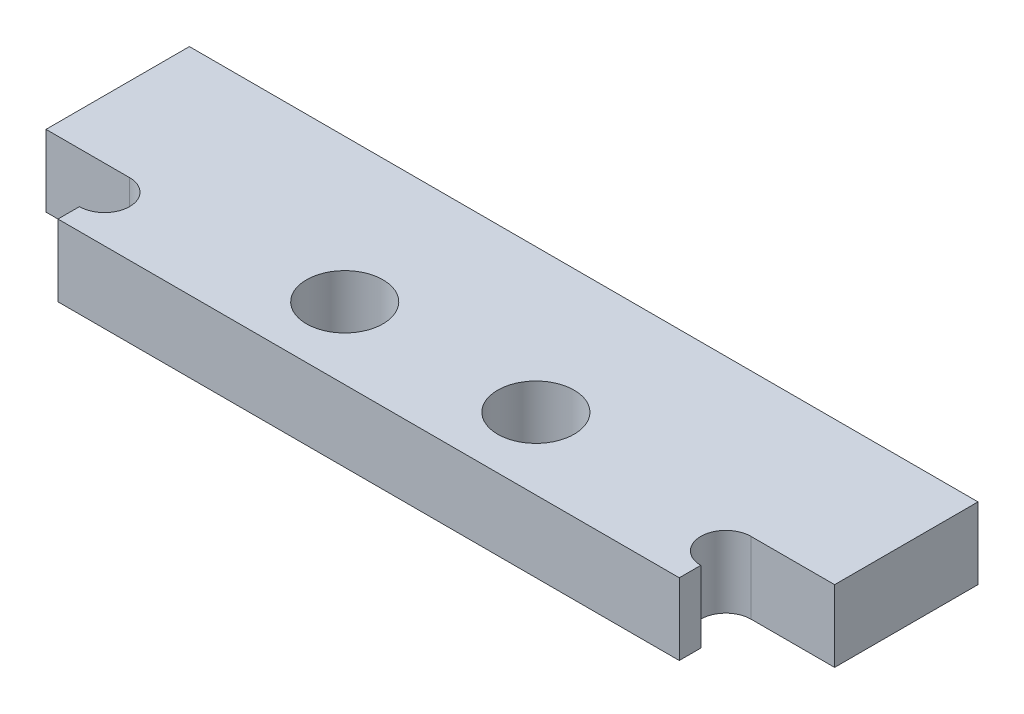
ISO-10303-21;
HEADER;
FILE_DESCRIPTION(('STEP AP214'),'2;1');
FILE_NAME('part.step','',(''),(''),'','','');
FILE_SCHEMA(('AUTOMOTIVE_DESIGN { 1 0 10303 214 1 1 1 1 }'));
ENDSEC;
DATA;
#1=APPLICATION_CONTEXT('core data for automotive mechanical design processes');
#2=APPLICATION_PROTOCOL_DEFINITION('international standard','automotive_design',2000,#1);
#3=PRODUCT_CONTEXT('',#1,'mechanical');
#4=PRODUCT('Part','Part','',(#3));
#5=PRODUCT_RELATED_PRODUCT_CATEGORY('part','',(#4));
#6=PRODUCT_DEFINITION_FORMATION('','',#4);
#7=PRODUCT_DEFINITION_CONTEXT('part definition',#1,'design');
#8=PRODUCT_DEFINITION('design','',#6,#7);
#9=PRODUCT_DEFINITION_SHAPE('','',#8);
#10=(LENGTH_UNIT() NAMED_UNIT(*) SI_UNIT(.MILLI.,.METRE.));
#11=(NAMED_UNIT(*) PLANE_ANGLE_UNIT() SI_UNIT($,.RADIAN.));
#12=(NAMED_UNIT(*) SI_UNIT($,.STERADIAN.) SOLID_ANGLE_UNIT());
#13=UNCERTAINTY_MEASURE_WITH_UNIT(LENGTH_MEASURE(1.E-05),#10,'distance_accuracy_value','');
#14=(GEOMETRIC_REPRESENTATION_CONTEXT(3) GLOBAL_UNCERTAINTY_ASSIGNED_CONTEXT((#13)) GLOBAL_UNIT_ASSIGNED_CONTEXT((#10,
#11,#12)) REPRESENTATION_CONTEXT('',''));
#15=CARTESIAN_POINT('',(0.,0.,0.));
#16=DIRECTION('',(0.,0.,1.));
#17=DIRECTION('',(1.,0.,0.));
#18=AXIS2_PLACEMENT_3D('',#15,#16,#17);
#19=CARTESIAN_POINT('',(13.,3.,0.));
#20=DIRECTION('',(-1.,0.,0.));
#21=DIRECTION('',(0.,0.,1.));
#22=AXIS2_PLACEMENT_3D('',#19,#20,#21);
#23=PLANE('',#22);
#24=DIRECTION('',(0.,0.,-1.));
#25=VECTOR('',#24,1.);
#26=CARTESIAN_POINT('',(13.,0.,0.));
#27=LINE('',#26,#25);
#28=CARTESIAN_POINT('',(13.,0.,6.));
#29=VERTEX_POINT('',#28);
#30=CARTESIAN_POINT('',(13.,0.,5.1));
#31=VERTEX_POINT('',#30);
#32=EDGE_CURVE('E152',#29,#31,#27,.T.);
#33=ORIENTED_EDGE('',*,*,#32,.T.);
#34=DIRECTION('',(0.,-1.,0.));
#35=VECTOR('',#34,1.);
#36=CARTESIAN_POINT('',(13.,3.,5.1));
#37=LINE('',#36,#35);
#38=CARTESIAN_POINT('',(13.,3.,5.1));
#39=VERTEX_POINT('',#38);
#40=EDGE_CURVE('E11',#39,#31,#37,.T.);
#41=ORIENTED_EDGE('',*,*,#40,.F.);
#42=DIRECTION('',(0.,0.,-1.));
#43=VECTOR('',#42,1.);
#44=CARTESIAN_POINT('',(13.,3.,0.));
#45=LINE('',#44,#43);
#46=CARTESIAN_POINT('',(13.,3.,6.));
#47=VERTEX_POINT('',#46);
#48=EDGE_CURVE('E353',#47,#39,#45,.T.);
#49=ORIENTED_EDGE('',*,*,#48,.F.);
#50=DIRECTION('',(0.,-1.,0.));
#51=VECTOR('',#50,1.);
#52=CARTESIAN_POINT('',(13.,3.,6.));
#53=LINE('',#52,#51);
#54=EDGE_CURVE('E53',#47,#29,#53,.T.);
#55=ORIENTED_EDGE('',*,*,#54,.T.);
#56=EDGE_LOOP('',(#33,#41,#49,#55));
#57=FACE_BOUND('',#56,.T.);
#58=ADVANCED_FACE('F36',(#57),#23,.F.);
#59=CARTESIAN_POINT('',(13.,3.,4.05));
#60=DIRECTION('',(0.,-1.,0.));
#61=DIRECTION('',(0.,0.,-1.));
#62=AXIS2_PLACEMENT_3D('',#59,#60,#61);
#63=CYLINDRICAL_SURFACE('',#62,1.05);
#64=CARTESIAN_POINT('',(13.,0.,4.05));
#65=DIRECTION('',(0.,1.,0.));
#66=DIRECTION('',(0.,0.,1.));
#67=AXIS2_PLACEMENT_3D('',#64,#65,#66);
#68=CIRCLE('',#67,1.05);
#69=CARTESIAN_POINT('',(13.,0.,3.));
#70=VERTEX_POINT('',#69);
#71=EDGE_CURVE('E154',#31,#70,#68,.F.);
#72=ORIENTED_EDGE('',*,*,#71,.T.);
#73=DIRECTION('',(0.,-1.,0.));
#74=VECTOR('',#73,1.);
#75=CARTESIAN_POINT('',(13.,3.,3.));
#76=LINE('',#75,#74);
#77=CARTESIAN_POINT('',(13.,3.,3.));
#78=VERTEX_POINT('',#77);
#79=EDGE_CURVE('E45',#78,#70,#76,.T.);
#80=ORIENTED_EDGE('',*,*,#79,.F.);
#81=CARTESIAN_POINT('',(13.,3.,4.05));
#82=DIRECTION('',(0.,1.,0.));
#83=DIRECTION('',(0.,0.,1.));
#84=AXIS2_PLACEMENT_3D('',#81,#82,#83);
#85=CIRCLE('',#84,1.05);
#86=EDGE_CURVE('E97',#39,#78,#85,.F.);
#87=ORIENTED_EDGE('',*,*,#86,.F.);
#88=ORIENTED_EDGE('',*,*,#40,.T.);
#89=EDGE_LOOP('',(#72,#80,#87,#88));
#90=FACE_BOUND('',#89,.T.);
#91=ADVANCED_FACE('F233',(#90),#63,.F.);
#92=CARTESIAN_POINT('',(0.,3.,3.));
#93=DIRECTION('',(0.,0.,-1.));
#94=DIRECTION('',(-1.,0.,0.));
#95=AXIS2_PLACEMENT_3D('',#92,#93,#94);
#96=PLANE('',#95);
#97=DIRECTION('',(1.,0.,0.));
#98=VECTOR('',#97,1.);
#99=CARTESIAN_POINT('',(0.,0.,3.));
#100=LINE('',#99,#98);
#101=CARTESIAN_POINT('',(16.5,0.,3.));
#102=VERTEX_POINT('',#101);
#103=EDGE_CURVE('E156',#70,#102,#100,.T.);
#104=ORIENTED_EDGE('',*,*,#103,.T.);
#105=DIRECTION('',(0.,-1.,0.));
#106=VECTOR('',#105,1.);
#107=CARTESIAN_POINT('',(16.5,3.,3.));
#108=LINE('',#107,#106);
#109=CARTESIAN_POINT('',(16.5,3.,3.));
#110=VERTEX_POINT('',#109);
#111=EDGE_CURVE('E186',#110,#102,#108,.T.);
#112=ORIENTED_EDGE('',*,*,#111,.F.);
#113=DIRECTION('',(1.,0.,0.));
#114=VECTOR('',#113,1.);
#115=CARTESIAN_POINT('',(0.,3.,3.));
#116=LINE('',#115,#114);
#117=EDGE_CURVE('E194',#78,#110,#116,.T.);
#118=ORIENTED_EDGE('',*,*,#117,.F.);
#119=ORIENTED_EDGE('',*,*,#79,.T.);
#120=EDGE_LOOP('',(#104,#112,#118,#119));
#121=FACE_BOUND('',#120,.T.);
#122=ADVANCED_FACE('F192',(#121),#96,.F.);
#123=CARTESIAN_POINT('',(16.5,3.,0.));
#124=DIRECTION('',(-1.,0.,0.));
#125=DIRECTION('',(0.,0.,1.));
#126=AXIS2_PLACEMENT_3D('',#123,#124,#125);
#127=PLANE('',#126);
#128=DIRECTION('',(0.,0.,-1.));
#129=VECTOR('',#128,1.);
#130=CARTESIAN_POINT('',(16.5,0.,0.));
#131=LINE('',#130,#129);
#132=CARTESIAN_POINT('',(16.5,0.,-3.));
#133=VERTEX_POINT('',#132);
#134=EDGE_CURVE('E158',#102,#133,#131,.T.);
#135=ORIENTED_EDGE('',*,*,#134,.T.);
#136=DIRECTION('',(0.,-1.,0.));
#137=VECTOR('',#136,1.);
#138=CARTESIAN_POINT('',(16.5,3.,-3.));
#139=LINE('',#138,#137);
#140=CARTESIAN_POINT('',(16.5,3.,-3.));
#141=VERTEX_POINT('',#140);
#142=EDGE_CURVE('E183',#141,#133,#139,.T.);
#143=ORIENTED_EDGE('',*,*,#142,.F.);
#144=DIRECTION('',(0.,0.,-1.));
#145=VECTOR('',#144,1.);
#146=CARTESIAN_POINT('',(16.5,3.,0.));
#147=LINE('',#146,#145);
#148=EDGE_CURVE('E210',#110,#141,#147,.T.);
#149=ORIENTED_EDGE('',*,*,#148,.F.);
#150=ORIENTED_EDGE('',*,*,#111,.T.);
#151=EDGE_LOOP('',(#135,#143,#149,#150));
#152=FACE_BOUND('',#151,.T.);
#153=ADVANCED_FACE('F201',(#152),#127,.F.);
#154=CARTESIAN_POINT('',(0.,3.,-3.));
#155=DIRECTION('',(0.,0.,1.));
#156=DIRECTION('',(1.,0.,0.));
#157=AXIS2_PLACEMENT_3D('',#154,#155,#156);
#158=PLANE('',#157);
#159=DIRECTION('',(-1.,0.,0.));
#160=VECTOR('',#159,1.);
#161=CARTESIAN_POINT('',(0.,0.,-3.));
#162=LINE('',#161,#160);
#163=CARTESIAN_POINT('',(-16.5,0.,-3.));
#164=VERTEX_POINT('',#163);
#165=EDGE_CURVE('E160',#133,#164,#162,.T.);
#166=ORIENTED_EDGE('',*,*,#165,.T.);
#167=DIRECTION('',(0.,-1.,0.));
#168=VECTOR('',#167,1.);
#169=CARTESIAN_POINT('',(-16.5,3.,-3.));
#170=LINE('',#169,#168);
#171=CARTESIAN_POINT('',(-16.5,3.,-3.));
#172=VERTEX_POINT('',#171);
#173=EDGE_CURVE('E181',#172,#164,#170,.T.);
#174=ORIENTED_EDGE('',*,*,#173,.F.);
#175=DIRECTION('',(-1.,0.,0.));
#176=VECTOR('',#175,1.);
#177=CARTESIAN_POINT('',(0.,3.,-3.));
#178=LINE('',#177,#176);
#179=EDGE_CURVE('E207',#141,#172,#178,.T.);
#180=ORIENTED_EDGE('',*,*,#179,.F.);
#181=ORIENTED_EDGE('',*,*,#142,.T.);
#182=EDGE_LOOP('',(#166,#174,#180,#181));
#183=FACE_BOUND('',#182,.T.);
#184=ADVANCED_FACE('F205',(#183),#158,.F.);
#185=CARTESIAN_POINT('',(-16.5,3.,0.));
#186=DIRECTION('',(-1.,0.,0.));
#187=DIRECTION('',(0.,0.,1.));
#188=AXIS2_PLACEMENT_3D('',#185,#186,#187);
#189=PLANE('',#188);
#190=DIRECTION('',(0.,0.,-1.));
#191=VECTOR('',#190,1.);
#192=CARTESIAN_POINT('',(-16.5,0.,0.));
#193=LINE('',#192,#191);
#194=CARTESIAN_POINT('',(-16.5,0.,3.));
#195=VERTEX_POINT('',#194);
#196=EDGE_CURVE('E163',#195,#164,#193,.T.);
#197=ORIENTED_EDGE('',*,*,#196,.F.);
#198=DIRECTION('',(0.,-1.,0.));
#199=VECTOR('',#198,1.);
#200=CARTESIAN_POINT('',(-16.5,3.,3.));
#201=LINE('',#200,#199);
#202=CARTESIAN_POINT('',(-16.5,3.,3.));
#203=VERTEX_POINT('',#202);
#204=EDGE_CURVE('E179',#203,#195,#201,.T.);
#205=ORIENTED_EDGE('',*,*,#204,.F.);
#206=DIRECTION('',(0.,0.,-1.));
#207=VECTOR('',#206,1.);
#208=CARTESIAN_POINT('',(-16.5,3.,0.));
#209=LINE('',#208,#207);
#210=EDGE_CURVE('E209',#203,#172,#209,.T.);
#211=ORIENTED_EDGE('',*,*,#210,.T.);
#212=ORIENTED_EDGE('',*,*,#173,.T.);
#213=EDGE_LOOP('',(#197,#205,#211,#212));
#214=FACE_BOUND('',#213,.T.);
#215=ADVANCED_FACE('F298',(#214),#189,.T.);
#216=CARTESIAN_POINT('',(0.,3.,3.));
#217=DIRECTION('',(0.,0.,1.));
#218=DIRECTION('',(1.,0.,0.));
#219=AXIS2_PLACEMENT_3D('',#216,#217,#218);
#220=PLANE('',#219);
#221=DIRECTION('',(-1.,0.,0.));
#222=VECTOR('',#221,1.);
#223=CARTESIAN_POINT('',(0.,0.,3.));
#224=LINE('',#223,#222);
#225=CARTESIAN_POINT('',(-13.,0.,3.));
#226=VERTEX_POINT('',#225);
#227=EDGE_CURVE('E166',#226,#195,#224,.T.);
#228=ORIENTED_EDGE('',*,*,#227,.F.);
#229=DIRECTION('',(0.,-1.,0.));
#230=VECTOR('',#229,1.);
#231=CARTESIAN_POINT('',(-13.,3.,3.));
#232=LINE('',#231,#230);
#233=CARTESIAN_POINT('',(-13.,3.,3.));
#234=VERTEX_POINT('',#233);
#235=EDGE_CURVE('E128',#234,#226,#232,.T.);
#236=ORIENTED_EDGE('',*,*,#235,.F.);
#237=DIRECTION('',(-1.,0.,0.));
#238=VECTOR('',#237,1.);
#239=CARTESIAN_POINT('',(0.,3.,3.));
#240=LINE('',#239,#238);
#241=EDGE_CURVE('E138',#234,#203,#240,.T.);
#242=ORIENTED_EDGE('',*,*,#241,.T.);
#243=ORIENTED_EDGE('',*,*,#204,.T.);
#244=EDGE_LOOP('',(#228,#236,#242,#243));
#245=FACE_BOUND('',#244,.T.);
#246=ADVANCED_FACE('F217',(#245),#220,.T.);
#247=CARTESIAN_POINT('',(-13.,3.,4.05));
#248=DIRECTION('',(0.,-1.,0.));
#249=DIRECTION('',(0.,0.,-1.));
#250=AXIS2_PLACEMENT_3D('',#247,#248,#249);
#251=CYLINDRICAL_SURFACE('',#250,1.05);
#252=CARTESIAN_POINT('',(-13.,0.,4.05));
#253=DIRECTION('',(0.,1.,0.));
#254=DIRECTION('',(0.,0.,1.));
#255=AXIS2_PLACEMENT_3D('',#252,#253,#254);
#256=CIRCLE('',#255,1.05);
#257=CARTESIAN_POINT('',(-13.,0.,5.1));
#258=VERTEX_POINT('',#257);
#259=EDGE_CURVE('E124',#258,#226,#256,.T.);
#260=ORIENTED_EDGE('',*,*,#259,.F.);
#261=DIRECTION('',(0.,-1.,0.));
#262=VECTOR('',#261,1.);
#263=CARTESIAN_POINT('',(-13.,3.,5.1));
#264=LINE('',#263,#262);
#265=CARTESIAN_POINT('',(-13.,3.,5.1));
#266=VERTEX_POINT('',#265);
#267=EDGE_CURVE('E119',#266,#258,#264,.T.);
#268=ORIENTED_EDGE('',*,*,#267,.F.);
#269=CARTESIAN_POINT('',(-13.,3.,4.05));
#270=DIRECTION('',(0.,1.,0.));
#271=DIRECTION('',(0.,0.,1.));
#272=AXIS2_PLACEMENT_3D('',#269,#270,#271);
#273=CIRCLE('',#272,1.05);
#274=EDGE_CURVE('E122',#266,#234,#273,.T.);
#275=ORIENTED_EDGE('',*,*,#274,.T.);
#276=ORIENTED_EDGE('',*,*,#235,.T.);
#277=EDGE_LOOP('',(#260,#268,#275,#276));
#278=FACE_BOUND('',#277,.T.);
#279=ADVANCED_FACE('F121',(#278),#251,.F.);
#280=CARTESIAN_POINT('',(-13.,3.,0.));
#281=DIRECTION('',(-1.,0.,0.));
#282=DIRECTION('',(0.,0.,1.));
#283=AXIS2_PLACEMENT_3D('',#280,#281,#282);
#284=PLANE('',#283);
#285=DIRECTION('',(0.,0.,-1.));
#286=VECTOR('',#285,1.);
#287=CARTESIAN_POINT('',(-13.,0.,0.));
#288=LINE('',#287,#286);
#289=CARTESIAN_POINT('',(-13.,0.,6.));
#290=VERTEX_POINT('',#289);
#291=EDGE_CURVE('E170',#290,#258,#288,.T.);
#292=ORIENTED_EDGE('',*,*,#291,.F.);
#293=DIRECTION('',(0.,-1.,0.));
#294=VECTOR('',#293,1.);
#295=CARTESIAN_POINT('',(-13.,3.,6.));
#296=LINE('',#295,#294);
#297=CARTESIAN_POINT('',(-13.,3.,6.));
#298=VERTEX_POINT('',#297);
#299=EDGE_CURVE('E85',#298,#290,#296,.T.);
#300=ORIENTED_EDGE('',*,*,#299,.F.);
#301=DIRECTION('',(0.,0.,-1.));
#302=VECTOR('',#301,1.);
#303=CARTESIAN_POINT('',(-13.,3.,0.));
#304=LINE('',#303,#302);
#305=EDGE_CURVE('E135',#298,#266,#304,.T.);
#306=ORIENTED_EDGE('',*,*,#305,.T.);
#307=ORIENTED_EDGE('',*,*,#267,.T.);
#308=EDGE_LOOP('',(#292,#300,#306,#307));
#309=FACE_BOUND('',#308,.T.);
#310=ADVANCED_FACE('F140',(#309),#284,.T.);
#311=CARTESIAN_POINT('',(4.,3.,3.));
#312=DIRECTION('',(0.,-1.,0.));
#313=DIRECTION('',(0.,0.,-1.));
#314=AXIS2_PLACEMENT_3D('',#311,#312,#313);
#315=CYLINDRICAL_SURFACE('',#314,1.6);
#316=CARTESIAN_POINT('',(4.,3.,3.));
#317=DIRECTION('',(0.,1.,0.));
#318=DIRECTION('',(0.,0.,1.));
#319=AXIS2_PLACEMENT_3D('',#316,#317,#318);
#320=CIRCLE('',#319,1.6);
#321=CARTESIAN_POINT('',(4.,3.,4.6));
#322=VERTEX_POINT('',#321);
#323=EDGE_CURVE('E248',#322,#322,#320,.F.);
#324=ORIENTED_EDGE('',*,*,#323,.F.);
#325=EDGE_LOOP('',(#324));
#326=FACE_BOUND('',#325,.T.);
#327=CARTESIAN_POINT('',(4.,0.,3.));
#328=DIRECTION('',(0.,1.,0.));
#329=DIRECTION('',(0.,0.,1.));
#330=AXIS2_PLACEMENT_3D('',#327,#328,#329);
#331=CIRCLE('',#330,1.6);
#332=CARTESIAN_POINT('',(4.,0.,4.6));
#333=VERTEX_POINT('',#332);
#334=EDGE_CURVE('E149',#333,#333,#331,.F.);
#335=ORIENTED_EDGE('',*,*,#334,.T.);
#336=EDGE_LOOP('',(#335));
#337=FACE_BOUND('',#336,.T.);
#338=ADVANCED_FACE('F228',(#326,#337),#315,.F.);
#339=CARTESIAN_POINT('',(-4.,3.,3.));
#340=DIRECTION('',(0.,-1.,0.));
#341=DIRECTION('',(0.,0.,-1.));
#342=AXIS2_PLACEMENT_3D('',#339,#340,#341);
#343=CYLINDRICAL_SURFACE('',#342,1.6);
#344=CARTESIAN_POINT('',(-4.,3.,3.));
#345=DIRECTION('',(0.,1.,0.));
#346=DIRECTION('',(0.,0.,1.));
#347=AXIS2_PLACEMENT_3D('',#344,#345,#346);
#348=CIRCLE('',#347,1.6);
#349=CARTESIAN_POINT('',(-4.,3.,4.6));
#350=VERTEX_POINT('',#349);
#351=EDGE_CURVE('E175',#350,#350,#348,.T.);
#352=ORIENTED_EDGE('',*,*,#351,.T.);
#353=EDGE_LOOP('',(#352));
#354=FACE_BOUND('',#353,.T.);
#355=CARTESIAN_POINT('',(-4.,0.,3.));
#356=DIRECTION('',(0.,1.,0.));
#357=DIRECTION('',(0.,0.,1.));
#358=AXIS2_PLACEMENT_3D('',#355,#356,#357);
#359=CIRCLE('',#358,1.6);
#360=CARTESIAN_POINT('',(-4.,0.,4.6));
#361=VERTEX_POINT('',#360);
#362=EDGE_CURVE('E146',#361,#361,#359,.T.);
#363=ORIENTED_EDGE('',*,*,#362,.F.);
#364=EDGE_LOOP('',(#363));
#365=FACE_BOUND('',#364,.T.);
#366=ADVANCED_FACE('F38',(#354,#365),#343,.F.);
#367=CARTESIAN_POINT('',(0.,3.,6.));
#368=DIRECTION('',(0.,0.,1.));
#369=DIRECTION('',(1.,0.,0.));
#370=AXIS2_PLACEMENT_3D('',#367,#368,#369);
#371=PLANE('',#370);
#372=DIRECTION('',(-1.,0.,0.));
#373=VECTOR('',#372,1.);
#374=CARTESIAN_POINT('',(0.,0.,6.));
#375=LINE('',#374,#373);
#376=EDGE_CURVE('E172',#29,#290,#375,.T.);
#377=ORIENTED_EDGE('',*,*,#376,.F.);
#378=ORIENTED_EDGE('',*,*,#54,.F.);
#379=DIRECTION('',(-1.,0.,0.));
#380=VECTOR('',#379,1.);
#381=CARTESIAN_POINT('',(0.,3.,6.));
#382=LINE('',#381,#380);
#383=EDGE_CURVE('E141',#47,#298,#382,.T.);
#384=ORIENTED_EDGE('',*,*,#383,.T.);
#385=ORIENTED_EDGE('',*,*,#299,.T.);
#386=EDGE_LOOP('',(#377,#378,#384,#385));
#387=FACE_BOUND('',#386,.T.);
#388=ADVANCED_FACE('F219',(#387),#371,.T.);
#389=CARTESIAN_POINT('',(0.,3.,0.));
#390=DIRECTION('',(0.,1.,0.));
#391=DIRECTION('',(0.,0.,1.));
#392=AXIS2_PLACEMENT_3D('',#389,#390,#391);
#393=PLANE('',#392);
#394=ORIENTED_EDGE('',*,*,#351,.F.);
#395=EDGE_LOOP('',(#394));
#396=FACE_BOUND('',#395,.T.);
#397=ORIENTED_EDGE('',*,*,#323,.T.);
#398=EDGE_LOOP('',(#397));
#399=FACE_BOUND('',#398,.T.);
#400=ORIENTED_EDGE('',*,*,#48,.T.);
#401=ORIENTED_EDGE('',*,*,#86,.T.);
#402=ORIENTED_EDGE('',*,*,#117,.T.);
#403=ORIENTED_EDGE('',*,*,#148,.T.);
#404=ORIENTED_EDGE('',*,*,#179,.T.);
#405=ORIENTED_EDGE('',*,*,#210,.F.);
#406=ORIENTED_EDGE('',*,*,#241,.F.);
#407=ORIENTED_EDGE('',*,*,#274,.F.);
#408=ORIENTED_EDGE('',*,*,#305,.F.);
#409=ORIENTED_EDGE('',*,*,#383,.F.);
#410=EDGE_LOOP('',(#400,#401,#402,#403,#404,#405,#406,#407,#408,#409));
#411=FACE_BOUND('',#410,.T.);
#412=ADVANCED_FACE('F133',(#396,#399,#411),#393,.T.);
#413=CARTESIAN_POINT('',(0.,0.,0.));
#414=DIRECTION('',(0.,1.,0.));
#415=DIRECTION('',(0.,0.,1.));
#416=AXIS2_PLACEMENT_3D('',#413,#414,#415);
#417=PLANE('',#416);
#418=ORIENTED_EDGE('',*,*,#362,.T.);
#419=EDGE_LOOP('',(#418));
#420=FACE_BOUND('',#419,.T.);
#421=ORIENTED_EDGE('',*,*,#334,.F.);
#422=EDGE_LOOP('',(#421));
#423=FACE_BOUND('',#422,.T.);
#424=ORIENTED_EDGE('',*,*,#32,.F.);
#425=ORIENTED_EDGE('',*,*,#376,.T.);
#426=ORIENTED_EDGE('',*,*,#291,.T.);
#427=ORIENTED_EDGE('',*,*,#259,.T.);
#428=ORIENTED_EDGE('',*,*,#227,.T.);
#429=ORIENTED_EDGE('',*,*,#196,.T.);
#430=ORIENTED_EDGE('',*,*,#165,.F.);
#431=ORIENTED_EDGE('',*,*,#134,.F.);
#432=ORIENTED_EDGE('',*,*,#103,.F.);
#433=ORIENTED_EDGE('',*,*,#71,.F.);
#434=EDGE_LOOP('',(#424,#425,#426,#427,#428,#429,#430,#431,#432,#433));
#435=FACE_BOUND('',#434,.T.);
#436=ADVANCED_FACE('F197',(#420,#423,#435),#417,.F.);
#437=CLOSED_SHELL('',(#58,#91,#122,#153,#184,#215,#246,#279,#310,#338,#366,#388,#412,#436));
#438=MANIFOLD_SOLID_BREP('B2',#437);
#439=ADVANCED_BREP_SHAPE_REPRESENTATION('',(#18,#438),#14);
#440=SHAPE_DEFINITION_REPRESENTATION(#9,#439);
ENDSEC;
END-ISO-10303-21;
